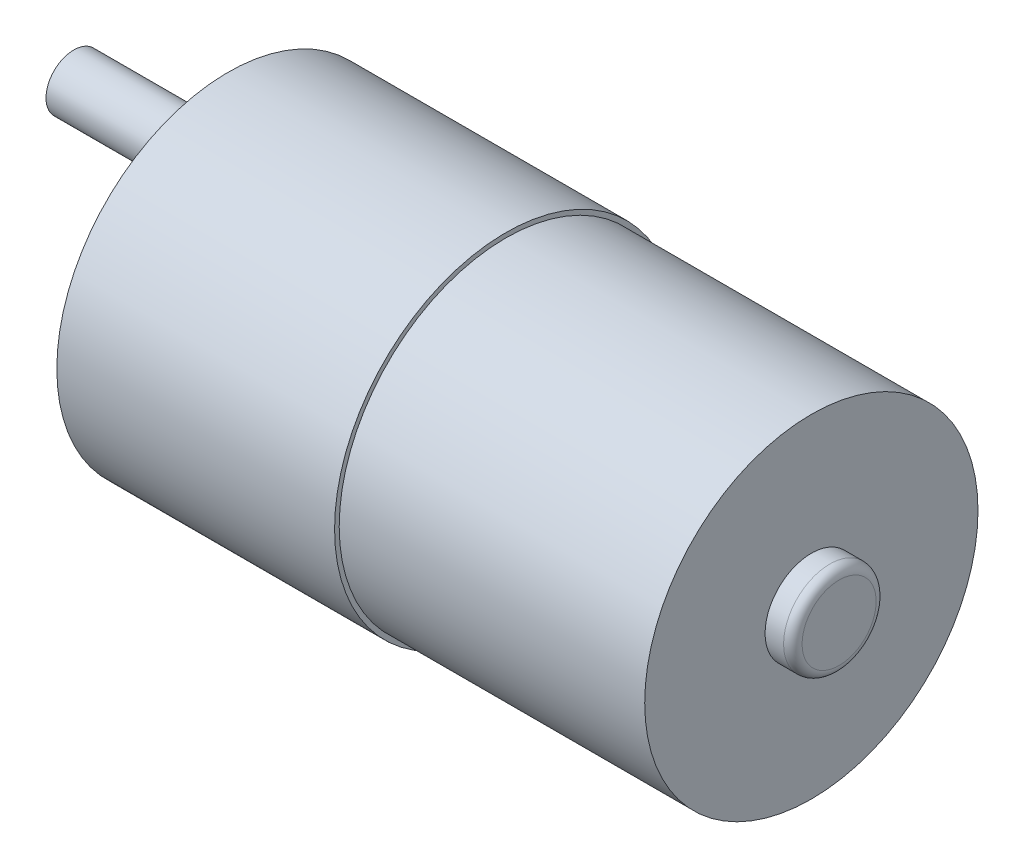
ISO-10303-21;
HEADER;
FILE_DESCRIPTION(('STEP AP214'),'2;1');
FILE_NAME('part.step','',(''),(''),'','','');
FILE_SCHEMA(('AUTOMOTIVE_DESIGN { 1 0 10303 214 1 1 1 1 }'));
ENDSEC;
DATA;
#1=APPLICATION_CONTEXT('core data for automotive mechanical design processes');
#2=APPLICATION_PROTOCOL_DEFINITION('international standard','automotive_design',2000,#1);
#3=PRODUCT_CONTEXT('',#1,'mechanical');
#4=PRODUCT('Part','Part','',(#3));
#5=PRODUCT_RELATED_PRODUCT_CATEGORY('part','',(#4));
#6=PRODUCT_DEFINITION_FORMATION('','',#4);
#7=PRODUCT_DEFINITION_CONTEXT('part definition',#1,'design');
#8=PRODUCT_DEFINITION('design','',#6,#7);
#9=PRODUCT_DEFINITION_SHAPE('','',#8);
#10=(LENGTH_UNIT() NAMED_UNIT(*) SI_UNIT(.MILLI.,.METRE.));
#11=(NAMED_UNIT(*) PLANE_ANGLE_UNIT() SI_UNIT($,.RADIAN.));
#12=(NAMED_UNIT(*) SI_UNIT($,.STERADIAN.) SOLID_ANGLE_UNIT());
#13=UNCERTAINTY_MEASURE_WITH_UNIT(LENGTH_MEASURE(1.E-05),#10,'distance_accuracy_value','');
#14=(GEOMETRIC_REPRESENTATION_CONTEXT(3) GLOBAL_UNCERTAINTY_ASSIGNED_CONTEXT((#13)) GLOBAL_UNIT_ASSIGNED_CONTEXT((#10,
#11,#12)) REPRESENTATION_CONTEXT('',''));
#15=CARTESIAN_POINT('',(0.,0.,0.));
#16=DIRECTION('',(0.,0.,1.));
#17=DIRECTION('',(1.,0.,0.));
#18=AXIS2_PLACEMENT_3D('',#15,#16,#17);
#19=CARTESIAN_POINT('',(0.,0.,0.));
#20=DIRECTION('',(1.,0.,0.));
#21=DIRECTION('',(0.,0.,-1.));
#22=AXIS2_PLACEMENT_3D('',#19,#20,#21);
#23=PLANE('',#22);
#24=CARTESIAN_POINT('',(0.,0.,0.));
#25=DIRECTION('',(-1.,0.,0.));
#26=DIRECTION('',(0.,0.,1.));
#27=AXIS2_PLACEMENT_3D('',#24,#25,#26);
#28=CIRCLE('',#27,18.);
#29=CARTESIAN_POINT('',(0.,0.,18.));
#30=VERTEX_POINT('',#29);
#31=EDGE_CURVE('E75',#30,#30,#28,.T.);
#32=ORIENTED_EDGE('',*,*,#31,.T.);
#33=EDGE_LOOP('',(#32));
#34=FACE_BOUND('',#33,.T.);
#35=CARTESIAN_POINT('',(0.,0.,0.));
#36=DIRECTION('',(-1.,0.,0.));
#37=DIRECTION('',(0.,0.,1.));
#38=AXIS2_PLACEMENT_3D('',#35,#36,#37);
#39=CIRCLE('',#38,18.5);
#40=CARTESIAN_POINT('',(0.,0.,18.5));
#41=VERTEX_POINT('',#40);
#42=EDGE_CURVE('E53',#41,#41,#39,.T.);
#43=ORIENTED_EDGE('',*,*,#42,.F.);
#44=EDGE_LOOP('',(#43));
#45=FACE_BOUND('',#44,.T.);
#46=ADVANCED_FACE('F47',(#34,#45),#23,.T.);
#47=CARTESIAN_POINT('',(-39.7142857142857,0.,0.));
#48=DIRECTION('',(-1.,0.,0.));
#49=DIRECTION('',(0.,0.,1.));
#50=AXIS2_PLACEMENT_3D('',#47,#48,#49);
#51=CYLINDRICAL_SURFACE('',#50,18.5);
#52=CARTESIAN_POINT('',(-30.,0.,0.));
#53=DIRECTION('',(-1.,0.,0.));
#54=DIRECTION('',(0.,0.,1.));
#55=AXIS2_PLACEMENT_3D('',#52,#53,#54);
#56=CIRCLE('',#55,18.5);
#57=CARTESIAN_POINT('',(-30.,0.,18.5));
#58=VERTEX_POINT('',#57);
#59=EDGE_CURVE('E57',#58,#58,#56,.T.);
#60=ORIENTED_EDGE('',*,*,#59,.F.);
#61=EDGE_LOOP('',(#60));
#62=FACE_BOUND('',#61,.T.);
#63=ORIENTED_EDGE('',*,*,#42,.T.);
#64=EDGE_LOOP('',(#63));
#65=FACE_BOUND('',#64,.T.);
#66=ADVANCED_FACE('F112',(#62,#65),#51,.T.);
#67=CARTESIAN_POINT('',(-30.,0.,0.));
#68=DIRECTION('',(1.,0.,0.));
#69=DIRECTION('',(0.,0.,-1.));
#70=AXIS2_PLACEMENT_3D('',#67,#68,#69);
#71=PLANE('',#70);
#72=CARTESIAN_POINT('',(-30.,0.250000000000002,-8.));
#73=DIRECTION('',(1.,0.,0.));
#74=DIRECTION('',(0.,0.,-1.));
#75=AXIS2_PLACEMENT_3D('',#72,#73,#74);
#76=CIRCLE('',#75,1.5);
#77=CARTESIAN_POINT('',(-30.,0.250000000000002,-9.50000000000001));
#78=VERTEX_POINT('',#77);
#79=EDGE_CURVE('E94',#78,#78,#76,.T.);
#80=ORIENTED_EDGE('',*,*,#79,.T.);
#81=EDGE_LOOP('',(#80));
#82=FACE_BOUND('',#81,.T.);
#83=CARTESIAN_POINT('',(-30.,0.25,8.));
#84=DIRECTION('',(1.,0.,0.));
#85=DIRECTION('',(0.,0.,-1.));
#86=AXIS2_PLACEMENT_3D('',#83,#84,#85);
#87=CIRCLE('',#86,1.5);
#88=CARTESIAN_POINT('',(-30.,0.25,6.5));
#89=VERTEX_POINT('',#88);
#90=EDGE_CURVE('E91',#89,#89,#87,.T.);
#91=ORIENTED_EDGE('',*,*,#90,.T.);
#92=EDGE_LOOP('',(#91));
#93=FACE_BOUND('',#92,.T.);
#94=CARTESIAN_POINT('',(-30.,9.25,0.));
#95=DIRECTION('',(1.,0.,0.));
#96=DIRECTION('',(0.,0.,-1.));
#97=AXIS2_PLACEMENT_3D('',#94,#95,#96);
#98=CIRCLE('',#97,6.);
#99=CARTESIAN_POINT('',(-30.,9.25,-6.));
#100=VERTEX_POINT('',#99);
#101=EDGE_CURVE('E10',#100,#100,#98,.F.);
#102=ORIENTED_EDGE('',*,*,#101,.F.);
#103=EDGE_LOOP('',(#102));
#104=FACE_BOUND('',#103,.T.);
#105=ORIENTED_EDGE('',*,*,#59,.T.);
#106=EDGE_LOOP('',(#105));
#107=FACE_BOUND('',#106,.T.);
#108=ADVANCED_FACE('F117',(#82,#93,#104,#107),#71,.F.);
#109=CARTESIAN_POINT('',(36.,0.,0.));
#110=DIRECTION('',(1.,0.,0.));
#111=DIRECTION('',(0.,0.,-1.));
#112=AXIS2_PLACEMENT_3D('',#109,#110,#111);
#113=PLANE('',#112);
#114=CARTESIAN_POINT('',(36.,0.,0.));
#115=DIRECTION('',(-1.,0.,0.));
#116=DIRECTION('',(0.,0.,1.));
#117=AXIS2_PLACEMENT_3D('',#114,#115,#116);
#118=CIRCLE('',#117,3.99999999999999);
#119=CARTESIAN_POINT('',(36.,0.,3.99999999999999));
#120=VERTEX_POINT('',#119);
#121=EDGE_CURVE('E61',#120,#120,#118,.T.);
#122=ORIENTED_EDGE('',*,*,#121,.F.);
#123=EDGE_LOOP('',(#122));
#124=FACE_BOUND('',#123,.T.);
#125=ADVANCED_FACE('F146',(#124),#113,.T.);
#126=CARTESIAN_POINT('',(35.,0.,0.));
#127=DIRECTION('',(-1.,0.,0.));
#128=DIRECTION('',(0.,0.,1.));
#129=AXIS2_PLACEMENT_3D('',#126,#127,#128);
#130=TOROIDAL_SURFACE('',#129,4.,1.);
#131=ORIENTED_EDGE('',*,*,#121,.T.);
#132=EDGE_LOOP('',(#131));
#133=FACE_BOUND('',#132,.T.);
#134=CARTESIAN_POINT('',(35.,0.,0.));
#135=DIRECTION('',(-1.,0.,0.));
#136=DIRECTION('',(0.,0.,1.));
#137=AXIS2_PLACEMENT_3D('',#134,#135,#136);
#138=CIRCLE('',#137,5.);
#139=CARTESIAN_POINT('',(35.,0.,5.));
#140=VERTEX_POINT('',#139);
#141=EDGE_CURVE('E66',#140,#140,#138,.T.);
#142=ORIENTED_EDGE('',*,*,#141,.F.);
#143=EDGE_LOOP('',(#142));
#144=FACE_BOUND('',#143,.T.);
#145=ADVANCED_FACE('F142',(#133,#144),#130,.T.);
#146=CARTESIAN_POINT('',(-39.7142857142857,0.,0.));
#147=DIRECTION('',(-1.,0.,0.));
#148=DIRECTION('',(0.,0.,1.));
#149=AXIS2_PLACEMENT_3D('',#146,#147,#148);
#150=CYLINDRICAL_SURFACE('',#149,5.);
#151=ORIENTED_EDGE('',*,*,#141,.T.);
#152=EDGE_LOOP('',(#151));
#153=FACE_BOUND('',#152,.T.);
#154=CARTESIAN_POINT('',(33.,0.,0.));
#155=DIRECTION('',(-1.,0.,0.));
#156=DIRECTION('',(0.,0.,1.));
#157=AXIS2_PLACEMENT_3D('',#154,#155,#156);
#158=CIRCLE('',#157,5.);
#159=CARTESIAN_POINT('',(33.,0.,5.));
#160=VERTEX_POINT('',#159);
#161=EDGE_CURVE('E69',#160,#160,#158,.T.);
#162=ORIENTED_EDGE('',*,*,#161,.F.);
#163=EDGE_LOOP('',(#162));
#164=FACE_BOUND('',#163,.T.);
#165=ADVANCED_FACE('F135',(#153,#164),#150,.T.);
#166=CARTESIAN_POINT('',(33.,0.,0.));
#167=DIRECTION('',(1.,0.,0.));
#168=DIRECTION('',(0.,0.,-1.));
#169=AXIS2_PLACEMENT_3D('',#166,#167,#168);
#170=PLANE('',#169);
#171=ORIENTED_EDGE('',*,*,#161,.T.);
#172=EDGE_LOOP('',(#171));
#173=FACE_BOUND('',#172,.T.);
#174=CARTESIAN_POINT('',(33.,0.,0.));
#175=DIRECTION('',(-1.,0.,0.));
#176=DIRECTION('',(0.,0.,1.));
#177=AXIS2_PLACEMENT_3D('',#174,#175,#176);
#178=CIRCLE('',#177,18.);
#179=CARTESIAN_POINT('',(33.,0.,18.));
#180=VERTEX_POINT('',#179);
#181=EDGE_CURVE('E72',#180,#180,#178,.T.);
#182=ORIENTED_EDGE('',*,*,#181,.F.);
#183=EDGE_LOOP('',(#182));
#184=FACE_BOUND('',#183,.T.);
#185=ADVANCED_FACE('F125',(#173,#184),#170,.T.);
#186=CARTESIAN_POINT('',(-39.7142857142857,0.,0.));
#187=DIRECTION('',(-1.,0.,0.));
#188=DIRECTION('',(0.,0.,1.));
#189=AXIS2_PLACEMENT_3D('',#186,#187,#188);
#190=CYLINDRICAL_SURFACE('',#189,18.);
#191=ORIENTED_EDGE('',*,*,#181,.T.);
#192=EDGE_LOOP('',(#191));
#193=FACE_BOUND('',#192,.T.);
#194=ORIENTED_EDGE('',*,*,#31,.F.);
#195=EDGE_LOOP('',(#194));
#196=FACE_BOUND('',#195,.T.);
#197=ADVANCED_FACE('F122',(#193,#196),#190,.T.);
#198=CARTESIAN_POINT('',(-54.77526305365,9.25,0.));
#199=DIRECTION('',(-1.,0.,0.));
#200=DIRECTION('',(0.,-1.,0.));
#201=AXIS2_PLACEMENT_3D('',#198,#199,#200);
#202=CYLINDRICAL_SURFACE('',#201,3.);
#203=CARTESIAN_POINT('',(-32.6714025874946,9.25,0.));
#204=DIRECTION('',(-1.,0.,0.));
#205=DIRECTION('',(0.,-1.,0.));
#206=AXIS2_PLACEMENT_3D('',#203,#204,#205);
#207=CIRCLE('',#206,3.);
#208=CARTESIAN_POINT('',(-32.6714025874946,6.25,0.));
#209=VERTEX_POINT('',#208);
#210=EDGE_CURVE('E84',#209,#209,#207,.T.);
#211=ORIENTED_EDGE('',*,*,#210,.T.);
#212=EDGE_LOOP('',(#211));
#213=FACE_BOUND('',#212,.T.);
#214=CARTESIAN_POINT('',(-46.6714025874946,9.25,0.));
#215=DIRECTION('',(-1.,0.,0.));
#216=DIRECTION('',(0.,-1.,0.));
#217=AXIS2_PLACEMENT_3D('',#214,#215,#216);
#218=CIRCLE('',#217,3.);
#219=CARTESIAN_POINT('',(-46.6714025874946,6.25,0.));
#220=VERTEX_POINT('',#219);
#221=EDGE_CURVE('E78',#220,#220,#218,.T.);
#222=ORIENTED_EDGE('',*,*,#221,.F.);
#223=EDGE_LOOP('',(#222));
#224=FACE_BOUND('',#223,.T.);
#225=ADVANCED_FACE('F124',(#213,#224),#202,.T.);
#226=CARTESIAN_POINT('',(-46.6714025874946,0.,0.));
#227=DIRECTION('',(-1.,0.,0.));
#228=DIRECTION('',(0.,-1.,0.));
#229=AXIS2_PLACEMENT_3D('',#226,#227,#228);
#230=PLANE('',#229);
#231=ORIENTED_EDGE('',*,*,#221,.T.);
#232=EDGE_LOOP('',(#231));
#233=FACE_BOUND('',#232,.T.);
#234=ADVANCED_FACE('F132',(#233),#230,.T.);
#235=CARTESIAN_POINT('',(-54.77526305365,9.25,0.));
#236=DIRECTION('',(-1.,0.,0.));
#237=DIRECTION('',(0.,-1.,0.));
#238=AXIS2_PLACEMENT_3D('',#235,#236,#237);
#239=CYLINDRICAL_SURFACE('',#238,6.);
#240=CARTESIAN_POINT('',(-32.6714025874946,9.25,0.));
#241=DIRECTION('',(-1.,0.,0.));
#242=DIRECTION('',(0.,-1.,0.));
#243=AXIS2_PLACEMENT_3D('',#240,#241,#242);
#244=CIRCLE('',#243,6.);
#245=CARTESIAN_POINT('',(-32.6714025874946,3.25,0.));
#246=VERTEX_POINT('',#245);
#247=EDGE_CURVE('E81',#246,#246,#244,.T.);
#248=ORIENTED_EDGE('',*,*,#247,.F.);
#249=EDGE_LOOP('',(#248));
#250=FACE_BOUND('',#249,.T.);
#251=ORIENTED_EDGE('',*,*,#101,.T.);
#252=EDGE_LOOP('',(#251));
#253=FACE_BOUND('',#252,.T.);
#254=ADVANCED_FACE('F173',(#250,#253),#239,.T.);
#255=CARTESIAN_POINT('',(-32.6714025874946,0.,0.));
#256=DIRECTION('',(1.,0.,0.));
#257=DIRECTION('',(0.,1.,0.));
#258=AXIS2_PLACEMENT_3D('',#255,#256,#257);
#259=PLANE('',#258);
#260=ORIENTED_EDGE('',*,*,#210,.F.);
#261=EDGE_LOOP('',(#260));
#262=FACE_BOUND('',#261,.T.);
#263=ORIENTED_EDGE('',*,*,#247,.T.);
#264=EDGE_LOOP('',(#263));
#265=FACE_BOUND('',#264,.T.);
#266=ADVANCED_FACE('F165',(#262,#265),#259,.F.);
#267=CARTESIAN_POINT('',(-29.,0.25,8.));
#268=DIRECTION('',(-1.,0.,0.));
#269=DIRECTION('',(0.,0.,1.));
#270=AXIS2_PLACEMENT_3D('',#267,#268,#269);
#271=CYLINDRICAL_SURFACE('',#270,1.5);
#272=CARTESIAN_POINT('',(-29.,0.25,8.));
#273=DIRECTION('',(1.,0.,0.));
#274=DIRECTION('',(0.,0.,-1.));
#275=AXIS2_PLACEMENT_3D('',#272,#273,#274);
#276=CIRCLE('',#275,1.5);
#277=CARTESIAN_POINT('',(-29.,0.25,6.5));
#278=VERTEX_POINT('',#277);
#279=EDGE_CURVE('E88',#278,#278,#276,.T.);
#280=ORIENTED_EDGE('',*,*,#279,.T.);
#281=EDGE_LOOP('',(#280));
#282=FACE_BOUND('',#281,.T.);
#283=ORIENTED_EDGE('',*,*,#90,.F.);
#284=EDGE_LOOP('',(#283));
#285=FACE_BOUND('',#284,.T.);
#286=ADVANCED_FACE('F164',(#282,#285),#271,.F.);
#287=CARTESIAN_POINT('',(-29.,0.25,8.));
#288=DIRECTION('',(1.,0.,0.));
#289=DIRECTION('',(0.,0.,-1.));
#290=AXIS2_PLACEMENT_3D('',#287,#288,#289);
#291=PLANE('',#290);
#292=ORIENTED_EDGE('',*,*,#279,.F.);
#293=EDGE_LOOP('',(#292));
#294=FACE_BOUND('',#293,.T.);
#295=ADVANCED_FACE('F109',(#294),#291,.F.);
#296=CARTESIAN_POINT('',(-29.,0.250000000000002,-8.));
#297=DIRECTION('',(-1.,0.,0.));
#298=DIRECTION('',(0.,0.,1.));
#299=AXIS2_PLACEMENT_3D('',#296,#297,#298);
#300=CYLINDRICAL_SURFACE('',#299,1.5);
#301=CARTESIAN_POINT('',(-29.,0.250000000000002,-8.));
#302=DIRECTION('',(1.,0.,0.));
#303=DIRECTION('',(0.,0.,-1.));
#304=AXIS2_PLACEMENT_3D('',#301,#302,#303);
#305=CIRCLE('',#304,1.5);
#306=CARTESIAN_POINT('',(-29.,0.250000000000002,-9.50000000000001));
#307=VERTEX_POINT('',#306);
#308=EDGE_CURVE('E87',#307,#307,#305,.T.);
#309=ORIENTED_EDGE('',*,*,#308,.T.);
#310=EDGE_LOOP('',(#309));
#311=FACE_BOUND('',#310,.T.);
#312=ORIENTED_EDGE('',*,*,#79,.F.);
#313=EDGE_LOOP('',(#312));
#314=FACE_BOUND('',#313,.T.);
#315=ADVANCED_FACE('F100',(#311,#314),#300,.F.);
#316=CARTESIAN_POINT('',(-29.,0.250000000000002,-8.));
#317=DIRECTION('',(1.,0.,0.));
#318=DIRECTION('',(0.,0.,-1.));
#319=AXIS2_PLACEMENT_3D('',#316,#317,#318);
#320=PLANE('',#319);
#321=ORIENTED_EDGE('',*,*,#308,.F.);
#322=EDGE_LOOP('',(#321));
#323=FACE_BOUND('',#322,.T.);
#324=ADVANCED_FACE('F103',(#323),#320,.F.);
#325=CLOSED_SHELL('',(#46,#66,#108,#125,#145,#165,#185,#197,#225,#234,#254,#266,#286,#295,#315,#324));
#326=MANIFOLD_SOLID_BREP('B2',#325);
#327=ADVANCED_BREP_SHAPE_REPRESENTATION('',(#18,#326),#14);
#328=SHAPE_DEFINITION_REPRESENTATION(#9,#327);
ENDSEC;
END-ISO-10303-21;
